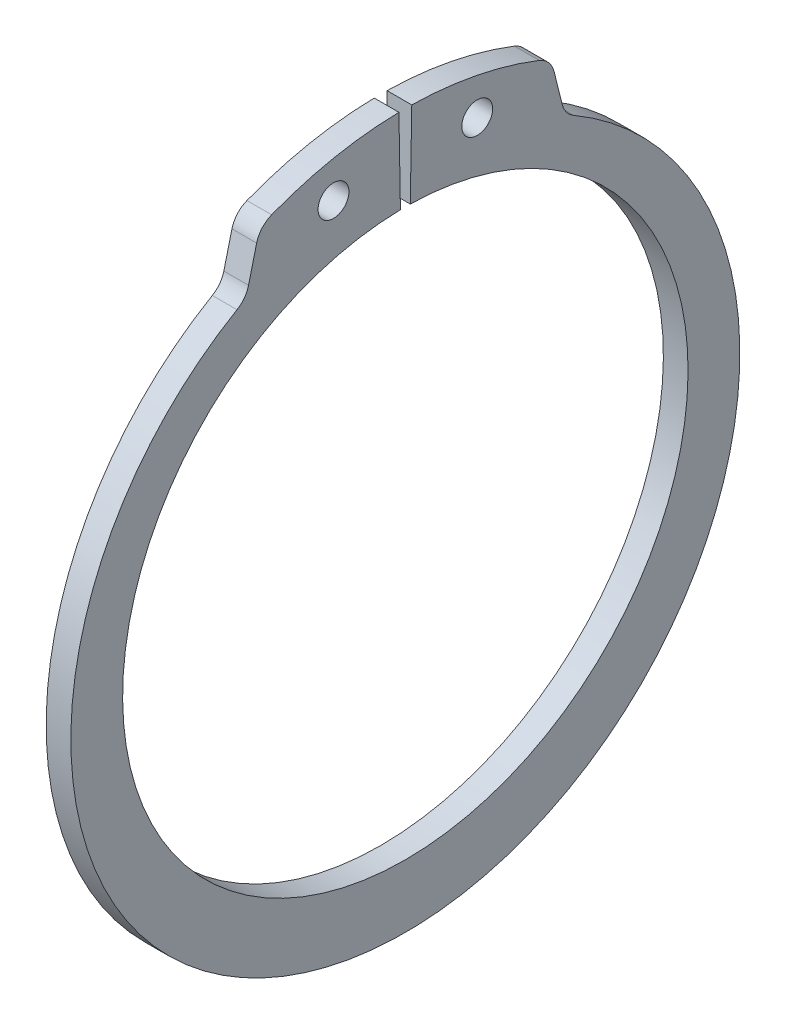
ISO-10303-21;
HEADER;
FILE_DESCRIPTION(('STEP AP214'),'2;1');
FILE_NAME('part.step','',(''),(''),'','','');
FILE_SCHEMA(('AUTOMOTIVE_DESIGN { 1 0 10303 214 1 1 1 1 }'));
ENDSEC;
DATA;
#1=APPLICATION_CONTEXT('core data for automotive mechanical design processes');
#2=APPLICATION_PROTOCOL_DEFINITION('international standard','automotive_design',2000,#1);
#3=PRODUCT_CONTEXT('',#1,'mechanical');
#4=PRODUCT('Part','Part','',(#3));
#5=PRODUCT_RELATED_PRODUCT_CATEGORY('part','',(#4));
#6=PRODUCT_DEFINITION_FORMATION('','',#4);
#7=PRODUCT_DEFINITION_CONTEXT('part definition',#1,'design');
#8=PRODUCT_DEFINITION('design','',#6,#7);
#9=PRODUCT_DEFINITION_SHAPE('','',#8);
#10=(LENGTH_UNIT() NAMED_UNIT(*) SI_UNIT(.MILLI.,.METRE.));
#11=(NAMED_UNIT(*) PLANE_ANGLE_UNIT() SI_UNIT($,.RADIAN.));
#12=(NAMED_UNIT(*) SI_UNIT($,.STERADIAN.) SOLID_ANGLE_UNIT());
#13=UNCERTAINTY_MEASURE_WITH_UNIT(LENGTH_MEASURE(1.E-05),#10,'distance_accuracy_value','');
#14=(GEOMETRIC_REPRESENTATION_CONTEXT(3) GLOBAL_UNCERTAINTY_ASSIGNED_CONTEXT((#13)) GLOBAL_UNIT_ASSIGNED_CONTEXT((#10,
#11,#12)) REPRESENTATION_CONTEXT('',''));
#15=CARTESIAN_POINT('',(0.,0.,0.));
#16=DIRECTION('',(0.,0.,1.));
#17=DIRECTION('',(1.,0.,0.));
#18=AXIS2_PLACEMENT_3D('',#15,#16,#17);
#19=CARTESIAN_POINT('',(1.,0.,0.));
#20=DIRECTION('',(1.,0.,0.));
#21=DIRECTION('',(0.,0.,-1.));
#22=AXIS2_PLACEMENT_3D('',#19,#20,#21);
#23=PLANE('',#22);
#24=CARTESIAN_POINT('',(1.,26.2524208392284,5.82025934285573));
#25=DIRECTION('',(1.,0.,0.));
#26=DIRECTION('',(0.,0.,-1.));
#27=AXIS2_PLACEMENT_3D('',#24,#25,#26);
#28=CIRCLE('',#27,1.25);
#29=CARTESIAN_POINT('',(1.,26.2524208392284,4.57025934285573));
#30=VERTEX_POINT('',#29);
#31=EDGE_CURVE('E217',#30,#30,#28,.T.);
#32=ORIENTED_EDGE('',*,*,#31,.F.);
#33=EDGE_LOOP('',(#32));
#34=FACE_BOUND('',#33,.T.);
#35=CARTESIAN_POINT('',(1.,0.,0.));
#36=DIRECTION('',(1.,0.,0.));
#37=DIRECTION('',(0.,0.,-1.));
#38=AXIS2_PLACEMENT_3D('',#35,#36,#37);
#39=CIRCLE('',#38,29.8);
#40=CARTESIAN_POINT('',(1.,29.7954613156605,0.52008171183105));
#41=VERTEX_POINT('',#40);
#42=CARTESIAN_POINT('',(1.,27.7618124813202,10.8315173337816));
#43=VERTEX_POINT('',#42);
#44=EDGE_CURVE('E134',#41,#43,#39,.T.);
#45=ORIENTED_EDGE('',*,*,#44,.T.);
#46=CARTESIAN_POINT('',(1.,25.8986035899565,10.1045698617158));
#47=DIRECTION('',(1.,0.,0.));
#48=DIRECTION('',(0.,0.,-1.));
#49=AXIS2_PLACEMENT_3D('',#46,#47,#48);
#50=CIRCLE('',#49,2.);
#51=CARTESIAN_POINT('',(1.,26.3824473811558,12.0451613142678));
#52=VERTEX_POINT('',#51);
#53=EDGE_CURVE('E171',#43,#52,#50,.T.);
#54=ORIENTED_EDGE('',*,*,#53,.T.);
#55=DIRECTION('',(0.,-0.970295726275997,0.241921895599664));
#56=VECTOR('',#55,1.);
#57=CARTESIAN_POINT('',(1.,27.364026424585,11.8004261717368));
#58=LINE('',#57,#56);
#59=CARTESIAN_POINT('',(1.,23.7499862908016,12.7015075804881));
#60=VERTEX_POINT('',#59);
#61=EDGE_CURVE('E209',#52,#60,#58,.T.);
#62=ORIENTED_EDGE('',*,*,#61,.T.);
#63=CARTESIAN_POINT('',(1.,24.2338300820009,14.6420990330401));
#64=DIRECTION('',(1.,0.,0.));
#65=DIRECTION('',(0.,0.,-1.));
#66=AXIS2_PLACEMENT_3D('',#63,#64,#65);
#67=CIRCLE('',#66,2.);
#68=CARTESIAN_POINT('',(1.,22.5055810159583,13.635542941348));
#69=VERTEX_POINT('',#68);
#70=EDGE_CURVE('E182',#60,#69,#67,.F.);
#71=ORIENTED_EDGE('',*,*,#70,.T.);
#72=CARTESIAN_POINT('',(1.,-0.906541316689946,0.));
#73=DIRECTION('',(1.,0.,0.));
#74=DIRECTION('',(0.,0.,-1.));
#75=AXIS2_PLACEMENT_3D('',#72,#73,#74);
#76=CIRCLE('',#75,27.0934586833101);
#77=CARTESIAN_POINT('',(1.,22.5055810159583,-13.6355429413479));
#78=VERTEX_POINT('',#77);
#79=EDGE_CURVE('E204',#69,#78,#76,.T.);
#80=ORIENTED_EDGE('',*,*,#79,.T.);
#81=CARTESIAN_POINT('',(1.,24.2338300820009,-14.6420990330401));
#82=DIRECTION('',(1.,0.,0.));
#83=DIRECTION('',(0.,0.,-1.));
#84=AXIS2_PLACEMENT_3D('',#81,#82,#83);
#85=CIRCLE('',#84,2.);
#86=CARTESIAN_POINT('',(1.,23.7499862908016,-12.7015075804881));
#87=VERTEX_POINT('',#86);
#88=EDGE_CURVE('E11',#78,#87,#85,.F.);
#89=ORIENTED_EDGE('',*,*,#88,.T.);
#90=DIRECTION('',(0.,0.970295726275998,0.241921895599664));
#91=VECTOR('',#90,1.);
#92=CARTESIAN_POINT('',(1.,27.364026424585,-11.8004261717368));
#93=LINE('',#92,#91);
#94=CARTESIAN_POINT('',(1.,26.3824473811558,-12.0451613142678));
#95=VERTEX_POINT('',#94);
#96=EDGE_CURVE('E203',#87,#95,#93,.T.);
#97=ORIENTED_EDGE('',*,*,#96,.T.);
#98=CARTESIAN_POINT('',(1.,25.8986035899565,-10.1045698617158));
#99=DIRECTION('',(1.,0.,0.));
#100=DIRECTION('',(0.,0.,-1.));
#101=AXIS2_PLACEMENT_3D('',#98,#99,#100);
#102=CIRCLE('',#101,2.);
#103=CARTESIAN_POINT('',(1.,27.7618124813202,-10.8315173337816));
#104=VERTEX_POINT('',#103);
#105=EDGE_CURVE('E49',#95,#104,#102,.T.);
#106=ORIENTED_EDGE('',*,*,#105,.T.);
#107=CARTESIAN_POINT('',(1.,0.,0.));
#108=DIRECTION('',(1.,0.,0.));
#109=DIRECTION('',(0.,0.,1.));
#110=AXIS2_PLACEMENT_3D('',#107,#108,#109);
#111=CIRCLE('',#110,29.8);
#112=CARTESIAN_POINT('',(1.,29.7954613156605,-0.520081711831054));
#113=VERTEX_POINT('',#112);
#114=EDGE_CURVE('E206',#104,#113,#111,.T.);
#115=ORIENTED_EDGE('',*,*,#114,.T.);
#116=DIRECTION('',(0.,-0.999847695156391,0.0174524064372843));
#117=VECTOR('',#116,1.);
#118=CARTESIAN_POINT('',(1.,29.7954613156605,-0.520081711831055));
#119=LINE('',#118,#117);
#120=CARTESIAN_POINT('',(1.,22.8965122190814,-0.399660107413793));
#121=VERTEX_POINT('',#120);
#122=EDGE_CURVE('E140',#113,#121,#119,.T.);
#123=ORIENTED_EDGE('',*,*,#122,.T.);
#124=CARTESIAN_POINT('',(1.,0.,0.));
#125=DIRECTION('',(-1.,0.,0.));
#126=DIRECTION('',(0.,0.,-1.));
#127=AXIS2_PLACEMENT_3D('',#124,#125,#126);
#128=CIRCLE('',#127,22.9);
#129=CARTESIAN_POINT('',(1.,22.8965122190814,0.399660107413793));
#130=VERTEX_POINT('',#129);
#131=EDGE_CURVE('E135',#121,#130,#128,.T.);
#132=ORIENTED_EDGE('',*,*,#131,.T.);
#133=DIRECTION('',(0.,0.999847695156391,0.0174524064372836));
#134=VECTOR('',#133,1.);
#135=CARTESIAN_POINT('',(1.,22.8965122190814,0.399660107413793));
#136=LINE('',#135,#134);
#137=EDGE_CURVE('E124',#130,#41,#136,.T.);
#138=ORIENTED_EDGE('',*,*,#137,.T.);
#139=EDGE_LOOP('',(#45,#54,#62,#71,#80,#89,#97,#106,#115,#123,#132,#138));
#140=FACE_BOUND('',#139,.T.);
#141=CARTESIAN_POINT('',(1.,26.2524208392284,-5.82025934285573));
#142=DIRECTION('',(1.,0.,0.));
#143=DIRECTION('',(0.,0.,-1.));
#144=AXIS2_PLACEMENT_3D('',#141,#142,#143);
#145=CIRCLE('',#144,1.25);
#146=CARTESIAN_POINT('',(1.,26.2524208392284,-7.07025934285573));
#147=VERTEX_POINT('',#146);
#148=EDGE_CURVE('E246',#147,#147,#145,.T.);
#149=ORIENTED_EDGE('',*,*,#148,.F.);
#150=EDGE_LOOP('',(#149));
#151=FACE_BOUND('',#150,.T.);
#152=ADVANCED_FACE('F34',(#34,#140,#151),#23,.T.);
#153=CARTESIAN_POINT('',(-1.,0.,0.));
#154=DIRECTION('',(1.,0.,0.));
#155=DIRECTION('',(0.,0.,-1.));
#156=AXIS2_PLACEMENT_3D('',#153,#154,#155);
#157=PLANE('',#156);
#158=CARTESIAN_POINT('',(-1.,26.2524208392284,5.82025934285573));
#159=DIRECTION('',(1.,0.,0.));
#160=DIRECTION('',(0.,0.,-1.));
#161=AXIS2_PLACEMENT_3D('',#158,#159,#160);
#162=CIRCLE('',#161,1.25);
#163=CARTESIAN_POINT('',(-1.,26.2524208392284,4.57025934285573));
#164=VERTEX_POINT('',#163);
#165=EDGE_CURVE('E243',#164,#164,#162,.T.);
#166=ORIENTED_EDGE('',*,*,#165,.T.);
#167=EDGE_LOOP('',(#166));
#168=FACE_BOUND('',#167,.T.);
#169=DIRECTION('',(0.,-0.970295726275997,0.241921895599664));
#170=VECTOR('',#169,1.);
#171=CARTESIAN_POINT('',(-1.,27.364026424585,11.8004261717368));
#172=LINE('',#171,#170);
#173=CARTESIAN_POINT('',(-1.,26.3824473811558,12.0451613142678));
#174=VERTEX_POINT('',#173);
#175=CARTESIAN_POINT('',(-1.,23.7499862908016,12.7015075804881));
#176=VERTEX_POINT('',#175);
#177=EDGE_CURVE('E200',#174,#176,#172,.T.);
#178=ORIENTED_EDGE('',*,*,#177,.F.);
#179=CARTESIAN_POINT('',(-1.,25.8986035899565,10.1045698617158));
#180=DIRECTION('',(1.,0.,0.));
#181=DIRECTION('',(0.,0.,-1.));
#182=AXIS2_PLACEMENT_3D('',#179,#180,#181);
#183=CIRCLE('',#182,2.);
#184=CARTESIAN_POINT('',(-1.,27.7618124813202,10.8315173337816));
#185=VERTEX_POINT('',#184);
#186=EDGE_CURVE('E166',#174,#185,#183,.F.);
#187=ORIENTED_EDGE('',*,*,#186,.T.);
#188=CARTESIAN_POINT('',(-1.,0.,0.));
#189=DIRECTION('',(1.,0.,0.));
#190=DIRECTION('',(0.,0.,-1.));
#191=AXIS2_PLACEMENT_3D('',#188,#189,#190);
#192=CIRCLE('',#191,29.8);
#193=CARTESIAN_POINT('',(-1.,29.7954613156605,0.52008171183105));
#194=VERTEX_POINT('',#193);
#195=EDGE_CURVE('E219',#194,#185,#192,.T.);
#196=ORIENTED_EDGE('',*,*,#195,.F.);
#197=DIRECTION('',(0.,0.999847695156391,0.0174524064372836));
#198=VECTOR('',#197,1.);
#199=CARTESIAN_POINT('',(-1.,22.8965122190814,0.399660107413793));
#200=LINE('',#199,#198);
#201=CARTESIAN_POINT('',(-1.,22.8965122190814,0.399660107413793));
#202=VERTEX_POINT('',#201);
#203=EDGE_CURVE('E216',#202,#194,#200,.T.);
#204=ORIENTED_EDGE('',*,*,#203,.F.);
#205=CARTESIAN_POINT('',(-1.,0.,0.));
#206=DIRECTION('',(-1.,0.,0.));
#207=DIRECTION('',(0.,0.,-1.));
#208=AXIS2_PLACEMENT_3D('',#205,#206,#207);
#209=CIRCLE('',#208,22.9);
#210=CARTESIAN_POINT('',(-1.,22.8965122190814,-0.399660107413793));
#211=VERTEX_POINT('',#210);
#212=EDGE_CURVE('E148',#211,#202,#209,.T.);
#213=ORIENTED_EDGE('',*,*,#212,.F.);
#214=DIRECTION('',(0.,-0.999847695156391,0.0174524064372843));
#215=VECTOR('',#214,1.);
#216=CARTESIAN_POINT('',(-1.,29.7954613156605,-0.520081711831055));
#217=LINE('',#216,#215);
#218=CARTESIAN_POINT('',(-1.,29.7954613156605,-0.520081711831054));
#219=VERTEX_POINT('',#218);
#220=EDGE_CURVE('E144',#219,#211,#217,.T.);
#221=ORIENTED_EDGE('',*,*,#220,.F.);
#222=CARTESIAN_POINT('',(-1.,0.,0.));
#223=DIRECTION('',(1.,0.,0.));
#224=DIRECTION('',(0.,0.,1.));
#225=AXIS2_PLACEMENT_3D('',#222,#223,#224);
#226=CIRCLE('',#225,29.8);
#227=CARTESIAN_POINT('',(-1.,27.7618124813202,-10.8315173337816));
#228=VERTEX_POINT('',#227);
#229=EDGE_CURVE('E225',#228,#219,#226,.T.);
#230=ORIENTED_EDGE('',*,*,#229,.F.);
#231=CARTESIAN_POINT('',(-1.,25.8986035899565,-10.1045698617158));
#232=DIRECTION('',(1.,0.,0.));
#233=DIRECTION('',(0.,0.,-1.));
#234=AXIS2_PLACEMENT_3D('',#231,#232,#233);
#235=CIRCLE('',#234,2.);
#236=CARTESIAN_POINT('',(-1.,26.3824473811558,-12.0451613142678));
#237=VERTEX_POINT('',#236);
#238=EDGE_CURVE('E164',#228,#237,#235,.F.);
#239=ORIENTED_EDGE('',*,*,#238,.T.);
#240=DIRECTION('',(0.,0.970295726275998,0.241921895599664));
#241=VECTOR('',#240,1.);
#242=CARTESIAN_POINT('',(-1.,27.364026424585,-11.8004261717368));
#243=LINE('',#242,#241);
#244=CARTESIAN_POINT('',(-1.,23.7499862908016,-12.7015075804881));
#245=VERTEX_POINT('',#244);
#246=EDGE_CURVE('E191',#245,#237,#243,.T.);
#247=ORIENTED_EDGE('',*,*,#246,.F.);
#248=CARTESIAN_POINT('',(-1.,24.2338300820009,-14.6420990330401));
#249=DIRECTION('',(1.,0.,0.));
#250=DIRECTION('',(0.,0.,-1.));
#251=AXIS2_PLACEMENT_3D('',#248,#249,#250);
#252=CIRCLE('',#251,2.);
#253=CARTESIAN_POINT('',(-1.,22.5055810159583,-13.6355429413479));
#254=VERTEX_POINT('',#253);
#255=EDGE_CURVE('E42',#245,#254,#252,.T.);
#256=ORIENTED_EDGE('',*,*,#255,.T.);
#257=CARTESIAN_POINT('',(-1.,-0.906541316689946,0.));
#258=DIRECTION('',(1.,0.,0.));
#259=DIRECTION('',(0.,0.,-1.));
#260=AXIS2_PLACEMENT_3D('',#257,#258,#259);
#261=CIRCLE('',#260,27.0934586833101);
#262=CARTESIAN_POINT('',(-1.,22.5055810159583,13.635542941348));
#263=VERTEX_POINT('',#262);
#264=EDGE_CURVE('E190',#263,#254,#261,.T.);
#265=ORIENTED_EDGE('',*,*,#264,.F.);
#266=CARTESIAN_POINT('',(-1.,24.2338300820009,14.6420990330401));
#267=DIRECTION('',(1.,0.,0.));
#268=DIRECTION('',(0.,0.,-1.));
#269=AXIS2_PLACEMENT_3D('',#266,#267,#268);
#270=CIRCLE('',#269,2.);
#271=EDGE_CURVE('E180',#263,#176,#270,.T.);
#272=ORIENTED_EDGE('',*,*,#271,.T.);
#273=EDGE_LOOP('',(#178,#187,#196,#204,#213,#221,#230,#239,#247,#256,#265,#272));
#274=FACE_BOUND('',#273,.T.);
#275=CARTESIAN_POINT('',(-1.,26.2524208392284,-5.82025934285573));
#276=DIRECTION('',(1.,0.,0.));
#277=DIRECTION('',(0.,0.,-1.));
#278=AXIS2_PLACEMENT_3D('',#275,#276,#277);
#279=CIRCLE('',#278,1.25);
#280=CARTESIAN_POINT('',(-1.,26.2524208392284,-7.07025934285573));
#281=VERTEX_POINT('',#280);
#282=EDGE_CURVE('E249',#281,#281,#279,.T.);
#283=ORIENTED_EDGE('',*,*,#282,.T.);
#284=EDGE_LOOP('',(#283));
#285=FACE_BOUND('',#284,.T.);
#286=ADVANCED_FACE('F188',(#168,#274,#285),#157,.F.);
#287=CARTESIAN_POINT('',(1.,0.,0.));
#288=DIRECTION('',(-1.,0.,0.));
#289=DIRECTION('',(0.,0.,1.));
#290=AXIS2_PLACEMENT_3D('',#287,#288,#289);
#291=CYLINDRICAL_SURFACE('',#290,22.9);
#292=ORIENTED_EDGE('',*,*,#212,.T.);
#293=DIRECTION('',(-1.,0.,0.));
#294=VECTOR('',#293,1.);
#295=CARTESIAN_POINT('',(1.,22.8965122190814,0.399660107413793));
#296=LINE('',#295,#294);
#297=EDGE_CURVE('E128',#130,#202,#296,.T.);
#298=ORIENTED_EDGE('',*,*,#297,.F.);
#299=ORIENTED_EDGE('',*,*,#131,.F.);
#300=DIRECTION('',(-1.,0.,0.));
#301=VECTOR('',#300,1.);
#302=CARTESIAN_POINT('',(1.,22.8965122190814,-0.399660107413793));
#303=LINE('',#302,#301);
#304=EDGE_CURVE('E214',#121,#211,#303,.T.);
#305=ORIENTED_EDGE('',*,*,#304,.T.);
#306=EDGE_LOOP('',(#292,#298,#299,#305));
#307=FACE_BOUND('',#306,.T.);
#308=ADVANCED_FACE('F146',(#307),#291,.F.);
#309=CARTESIAN_POINT('',(1.,22.8965122190814,0.399660107413793));
#310=DIRECTION('',(0.,-0.0174524064372836,0.999847695156391));
#311=DIRECTION('',(0.,-0.999847695156391,-0.0174524064372836));
#312=AXIS2_PLACEMENT_3D('',#309,#310,#311);
#313=PLANE('',#312);
#314=ORIENTED_EDGE('',*,*,#203,.T.);
#315=DIRECTION('',(-1.,0.,0.));
#316=VECTOR('',#315,1.);
#317=CARTESIAN_POINT('',(1.,29.7954613156605,0.52008171183105));
#318=LINE('',#317,#316);
#319=EDGE_CURVE('E131',#41,#194,#318,.T.);
#320=ORIENTED_EDGE('',*,*,#319,.F.);
#321=ORIENTED_EDGE('',*,*,#137,.F.);
#322=ORIENTED_EDGE('',*,*,#297,.T.);
#323=EDGE_LOOP('',(#314,#320,#321,#322));
#324=FACE_BOUND('',#323,.T.);
#325=ADVANCED_FACE('F126',(#324),#313,.F.);
#326=CARTESIAN_POINT('',(1.,0.,0.));
#327=DIRECTION('',(-1.,0.,0.));
#328=DIRECTION('',(0.,0.,1.));
#329=AXIS2_PLACEMENT_3D('',#326,#327,#328);
#330=CYLINDRICAL_SURFACE('',#329,29.8);
#331=ORIENTED_EDGE('',*,*,#195,.T.);
#332=DIRECTION('',(-1.,0.,0.));
#333=VECTOR('',#332,1.);
#334=CARTESIAN_POINT('',(1.,27.7618124813202,10.8315173337816));
#335=LINE('',#334,#333);
#336=EDGE_CURVE('E168',#185,#43,#335,.F.);
#337=ORIENTED_EDGE('',*,*,#336,.T.);
#338=ORIENTED_EDGE('',*,*,#44,.F.);
#339=ORIENTED_EDGE('',*,*,#319,.T.);
#340=EDGE_LOOP('',(#331,#337,#338,#339));
#341=FACE_BOUND('',#340,.T.);
#342=ADVANCED_FACE('F237',(#341),#330,.T.);
#343=CARTESIAN_POINT('',(1.,27.364026424585,11.8004261717368));
#344=DIRECTION('',(0.,-0.241921895599665,-0.970295726275997));
#345=DIRECTION('',(0.,0.970295726275997,-0.241921895599665));
#346=AXIS2_PLACEMENT_3D('',#343,#344,#345);
#347=PLANE('',#346);
#348=ORIENTED_EDGE('',*,*,#177,.T.);
#349=DIRECTION('',(1.,0.,0.));
#350=VECTOR('',#349,1.);
#351=CARTESIAN_POINT('',(1.,23.7499862908016,12.7015075804881));
#352=LINE('',#351,#350);
#353=EDGE_CURVE('E162',#176,#60,#352,.T.);
#354=ORIENTED_EDGE('',*,*,#353,.T.);
#355=ORIENTED_EDGE('',*,*,#61,.F.);
#356=DIRECTION('',(-1.,0.,0.));
#357=VECTOR('',#356,1.);
#358=CARTESIAN_POINT('',(1.,26.3824473811558,12.0451613142678));
#359=LINE('',#358,#357);
#360=EDGE_CURVE('E159',#52,#174,#359,.T.);
#361=ORIENTED_EDGE('',*,*,#360,.T.);
#362=EDGE_LOOP('',(#348,#354,#355,#361));
#363=FACE_BOUND('',#362,.T.);
#364=ADVANCED_FACE('F279',(#363),#347,.F.);
#365=CARTESIAN_POINT('',(1.,-0.906541316689946,0.));
#366=DIRECTION('',(-1.,0.,0.));
#367=DIRECTION('',(0.,0.,1.));
#368=AXIS2_PLACEMENT_3D('',#365,#366,#367);
#369=CYLINDRICAL_SURFACE('',#368,27.0934586833101);
#370=ORIENTED_EDGE('',*,*,#79,.F.);
#371=DIRECTION('',(-1.,0.,0.));
#372=VECTOR('',#371,1.);
#373=CARTESIAN_POINT('',(1.,22.5055810159583,13.635542941348));
#374=LINE('',#373,#372);
#375=EDGE_CURVE('E151',#69,#263,#374,.T.);
#376=ORIENTED_EDGE('',*,*,#375,.T.);
#377=ORIENTED_EDGE('',*,*,#264,.T.);
#378=DIRECTION('',(-1.,0.,0.));
#379=VECTOR('',#378,1.);
#380=CARTESIAN_POINT('',(1.,22.5055810159583,-13.6355429413479));
#381=LINE('',#380,#379);
#382=EDGE_CURVE('E149',#254,#78,#381,.F.);
#383=ORIENTED_EDGE('',*,*,#382,.T.);
#384=EDGE_LOOP('',(#370,#376,#377,#383));
#385=FACE_BOUND('',#384,.T.);
#386=ADVANCED_FACE('F197',(#385),#369,.T.);
#387=CARTESIAN_POINT('',(1.,27.364026424585,-11.8004261717368));
#388=DIRECTION('',(0.,-0.241921895599664,0.970295726275997));
#389=DIRECTION('',(0.,-0.970295726275998,-0.241921895599664));
#390=AXIS2_PLACEMENT_3D('',#387,#388,#389);
#391=PLANE('',#390);
#392=ORIENTED_EDGE('',*,*,#246,.T.);
#393=DIRECTION('',(-1.,0.,0.));
#394=VECTOR('',#393,1.);
#395=CARTESIAN_POINT('',(1.,26.3824473811558,-12.0451613142678));
#396=LINE('',#395,#394);
#397=EDGE_CURVE('E57',#237,#95,#396,.F.);
#398=ORIENTED_EDGE('',*,*,#397,.T.);
#399=ORIENTED_EDGE('',*,*,#96,.F.);
#400=DIRECTION('',(1.,0.,0.));
#401=VECTOR('',#400,1.);
#402=CARTESIAN_POINT('',(-1.,23.7499862908016,-12.7015075804881));
#403=LINE('',#402,#401);
#404=EDGE_CURVE('E176',#87,#245,#403,.F.);
#405=ORIENTED_EDGE('',*,*,#404,.T.);
#406=EDGE_LOOP('',(#392,#398,#399,#405));
#407=FACE_BOUND('',#406,.T.);
#408=ADVANCED_FACE('F205',(#407),#391,.F.);
#409=CARTESIAN_POINT('',(1.,0.,0.));
#410=DIRECTION('',(-1.,0.,0.));
#411=DIRECTION('',(0.,0.,1.));
#412=AXIS2_PLACEMENT_3D('',#409,#410,#411);
#413=CYLINDRICAL_SURFACE('',#412,29.8);
#414=ORIENTED_EDGE('',*,*,#114,.F.);
#415=DIRECTION('',(-1.,0.,0.));
#416=VECTOR('',#415,1.);
#417=CARTESIAN_POINT('',(1.,27.7618124813202,-10.8315173337816));
#418=LINE('',#417,#416);
#419=EDGE_CURVE('E173',#104,#228,#418,.T.);
#420=ORIENTED_EDGE('',*,*,#419,.T.);
#421=ORIENTED_EDGE('',*,*,#229,.T.);
#422=DIRECTION('',(-1.,0.,0.));
#423=VECTOR('',#422,1.);
#424=CARTESIAN_POINT('',(1.,29.7954613156605,-0.520081711831054));
#425=LINE('',#424,#423);
#426=EDGE_CURVE('E153',#113,#219,#425,.T.);
#427=ORIENTED_EDGE('',*,*,#426,.F.);
#428=EDGE_LOOP('',(#414,#420,#421,#427));
#429=FACE_BOUND('',#428,.T.);
#430=ADVANCED_FACE('F272',(#429),#413,.T.);
#431=CARTESIAN_POINT('',(1.,29.7954613156605,-0.520081711831055));
#432=DIRECTION('',(0.,-0.0174524064372843,-0.999847695156391));
#433=DIRECTION('',(0.,0.999847695156391,-0.0174524064372843));
#434=AXIS2_PLACEMENT_3D('',#431,#432,#433);
#435=PLANE('',#434);
#436=ORIENTED_EDGE('',*,*,#220,.T.);
#437=ORIENTED_EDGE('',*,*,#304,.F.);
#438=ORIENTED_EDGE('',*,*,#122,.F.);
#439=ORIENTED_EDGE('',*,*,#426,.T.);
#440=EDGE_LOOP('',(#436,#437,#438,#439));
#441=FACE_BOUND('',#440,.T.);
#442=ADVANCED_FACE('F232',(#441),#435,.F.);
#443=CARTESIAN_POINT('',(1.,26.2524208392284,5.82025934285573));
#444=DIRECTION('',(-1.,0.,0.));
#445=DIRECTION('',(0.,0.,1.));
#446=AXIS2_PLACEMENT_3D('',#443,#444,#445);
#447=CYLINDRICAL_SURFACE('',#446,1.25);
#448=ORIENTED_EDGE('',*,*,#31,.T.);
#449=EDGE_LOOP('',(#448));
#450=FACE_BOUND('',#449,.T.);
#451=ORIENTED_EDGE('',*,*,#165,.F.);
#452=EDGE_LOOP('',(#451));
#453=FACE_BOUND('',#452,.T.);
#454=ADVANCED_FACE('F267',(#450,#453),#447,.F.);
#455=CARTESIAN_POINT('',(1.,26.2524208392284,-5.82025934285573));
#456=DIRECTION('',(-1.,0.,0.));
#457=DIRECTION('',(0.,0.,1.));
#458=AXIS2_PLACEMENT_3D('',#455,#456,#457);
#459=CYLINDRICAL_SURFACE('',#458,1.25);
#460=ORIENTED_EDGE('',*,*,#148,.T.);
#461=EDGE_LOOP('',(#460));
#462=FACE_BOUND('',#461,.T.);
#463=ORIENTED_EDGE('',*,*,#282,.F.);
#464=EDGE_LOOP('',(#463));
#465=FACE_BOUND('',#464,.T.);
#466=ADVANCED_FACE('F255',(#462,#465),#459,.F.);
#467=CARTESIAN_POINT('',(1.,24.2338300820009,14.6420990330401));
#468=DIRECTION('',(-1.,0.,0.));
#469=DIRECTION('',(0.,0.,1.));
#470=AXIS2_PLACEMENT_3D('',#467,#468,#469);
#471=CYLINDRICAL_SURFACE('',#470,2.);
#472=ORIENTED_EDGE('',*,*,#70,.F.);
#473=ORIENTED_EDGE('',*,*,#353,.F.);
#474=ORIENTED_EDGE('',*,*,#271,.F.);
#475=ORIENTED_EDGE('',*,*,#375,.F.);
#476=EDGE_LOOP('',(#472,#473,#474,#475));
#477=FACE_BOUND('',#476,.T.);
#478=ADVANCED_FACE('F289',(#477),#471,.F.);
#479=CARTESIAN_POINT('',(1.,25.8986035899565,10.1045698617158));
#480=DIRECTION('',(-1.,0.,0.));
#481=DIRECTION('',(0.,0.,1.));
#482=AXIS2_PLACEMENT_3D('',#479,#480,#481);
#483=CYLINDRICAL_SURFACE('',#482,2.);
#484=ORIENTED_EDGE('',*,*,#53,.F.);
#485=ORIENTED_EDGE('',*,*,#336,.F.);
#486=ORIENTED_EDGE('',*,*,#186,.F.);
#487=ORIENTED_EDGE('',*,*,#360,.F.);
#488=EDGE_LOOP('',(#484,#485,#486,#487));
#489=FACE_BOUND('',#488,.T.);
#490=ADVANCED_FACE('F292',(#489),#483,.T.);
#491=CARTESIAN_POINT('',(1.,25.8986035899565,-10.1045698617158));
#492=DIRECTION('',(-1.,0.,0.));
#493=DIRECTION('',(0.,0.,1.));
#494=AXIS2_PLACEMENT_3D('',#491,#492,#493);
#495=CYLINDRICAL_SURFACE('',#494,2.);
#496=ORIENTED_EDGE('',*,*,#105,.F.);
#497=ORIENTED_EDGE('',*,*,#397,.F.);
#498=ORIENTED_EDGE('',*,*,#238,.F.);
#499=ORIENTED_EDGE('',*,*,#419,.F.);
#500=EDGE_LOOP('',(#496,#497,#498,#499));
#501=FACE_BOUND('',#500,.T.);
#502=ADVANCED_FACE('F295',(#501),#495,.T.);
#503=CARTESIAN_POINT('',(1.,24.2338300820009,-14.6420990330401));
#504=DIRECTION('',(-1.,0.,0.));
#505=DIRECTION('',(0.,0.,1.));
#506=AXIS2_PLACEMENT_3D('',#503,#504,#505);
#507=CYLINDRICAL_SURFACE('',#506,2.);
#508=ORIENTED_EDGE('',*,*,#88,.F.);
#509=ORIENTED_EDGE('',*,*,#382,.F.);
#510=ORIENTED_EDGE('',*,*,#255,.F.);
#511=ORIENTED_EDGE('',*,*,#404,.F.);
#512=EDGE_LOOP('',(#508,#509,#510,#511));
#513=FACE_BOUND('',#512,.T.);
#514=ADVANCED_FACE('F36',(#513),#507,.F.);
#515=CLOSED_SHELL('',(#152,#286,#308,#325,#342,#364,#386,#408,#430,#442,#454,#466,#478,#490,
#502,#514));
#516=MANIFOLD_SOLID_BREP('B2',#515);
#517=ADVANCED_BREP_SHAPE_REPRESENTATION('',(#18,#516),#14);
#518=SHAPE_DEFINITION_REPRESENTATION(#9,#517);
ENDSEC;
END-ISO-10303-21;
